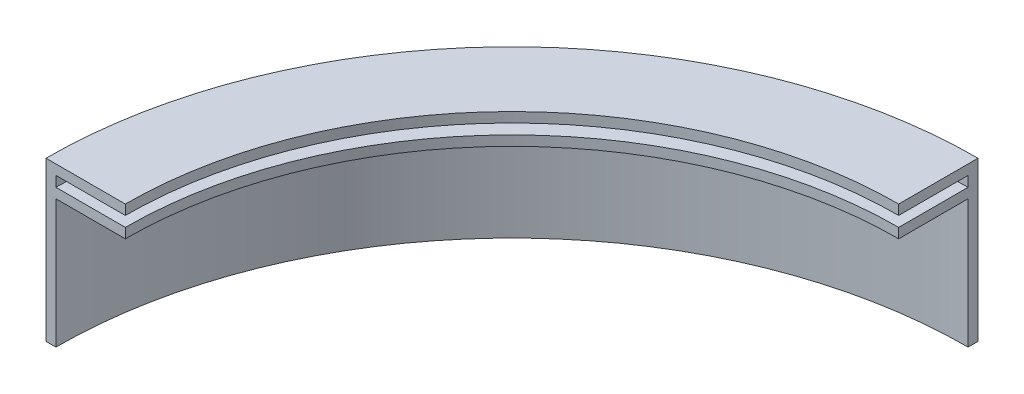
ISO-10303-21;
HEADER;
FILE_DESCRIPTION(('STEP AP214'),'2;1');
FILE_NAME('part.step','',(''),(''),'','','');
FILE_SCHEMA(('AUTOMOTIVE_DESIGN { 1 0 10303 214 1 1 1 1 }'));
ENDSEC;
DATA;
#1=APPLICATION_CONTEXT('core data for automotive mechanical design processes');
#2=APPLICATION_PROTOCOL_DEFINITION('international standard','automotive_design',2000,#1);
#3=PRODUCT_CONTEXT('',#1,'mechanical');
#4=PRODUCT('Part','Part','',(#3));
#5=PRODUCT_RELATED_PRODUCT_CATEGORY('part','',(#4));
#6=PRODUCT_DEFINITION_FORMATION('','',#4);
#7=PRODUCT_DEFINITION_CONTEXT('part definition',#1,'design');
#8=PRODUCT_DEFINITION('design','',#6,#7);
#9=PRODUCT_DEFINITION_SHAPE('','',#8);
#10=(LENGTH_UNIT() NAMED_UNIT(*) SI_UNIT(.MILLI.,.METRE.));
#11=(NAMED_UNIT(*) PLANE_ANGLE_UNIT() SI_UNIT($,.RADIAN.));
#12=(NAMED_UNIT(*) SI_UNIT($,.STERADIAN.) SOLID_ANGLE_UNIT());
#13=UNCERTAINTY_MEASURE_WITH_UNIT(LENGTH_MEASURE(1.E-05),#10,'distance_accuracy_value','');
#14=(GEOMETRIC_REPRESENTATION_CONTEXT(3) GLOBAL_UNCERTAINTY_ASSIGNED_CONTEXT((#13)) GLOBAL_UNIT_ASSIGNED_CONTEXT((#10,
#11,#12)) REPRESENTATION_CONTEXT('',''));
#15=CARTESIAN_POINT('',(0.,0.,0.));
#16=DIRECTION('',(0.,0.,1.));
#17=DIRECTION('',(1.,0.,0.));
#18=AXIS2_PLACEMENT_3D('',#15,#16,#17);
#19=CARTESIAN_POINT('',(149.225000000001,0.,-146.05));
#20=DIRECTION('',(0.,-1.,0.));
#21=DIRECTION('',(0.,0.,-1.));
#22=AXIS2_PLACEMENT_3D('',#19,#20,#21);
#23=PLANE('',#22);
#24=CARTESIAN_POINT('',(149.225,0.,0.));
#25=DIRECTION('',(0.,1.,0.));
#26=DIRECTION('',(0.,0.,1.));
#27=AXIS2_PLACEMENT_3D('',#24,#25,#26);
#28=CIRCLE('',#27,149.225);
#29=CARTESIAN_POINT('',(149.225000000001,0.,-149.225));
#30=VERTEX_POINT('',#29);
#31=CARTESIAN_POINT('',(0.,0.,0.));
#32=VERTEX_POINT('',#31);
#33=EDGE_CURVE('E11',#30,#32,#28,.T.);
#34=ORIENTED_EDGE('',*,*,#33,.F.);
#35=DIRECTION('',(0.,0.,1.));
#36=VECTOR('',#35,1.);
#37=CARTESIAN_POINT('',(149.225000000001,0.,-146.05));
#38=LINE('',#37,#36);
#39=CARTESIAN_POINT('',(149.225000000001,0.,-146.05));
#40=VERTEX_POINT('',#39);
#41=EDGE_CURVE('E109',#30,#40,#38,.T.);
#42=ORIENTED_EDGE('',*,*,#41,.T.);
#43=CARTESIAN_POINT('',(149.225,0.,0.));
#44=DIRECTION('',(0.,1.,0.));
#45=DIRECTION('',(0.,0.,1.));
#46=AXIS2_PLACEMENT_3D('',#43,#44,#45);
#47=CIRCLE('',#46,146.05);
#48=CARTESIAN_POINT('',(3.175,0.,0.));
#49=VERTEX_POINT('',#48);
#50=EDGE_CURVE('E104',#40,#49,#47,.T.);
#51=ORIENTED_EDGE('',*,*,#50,.T.);
#52=DIRECTION('',(1.,0.,0.));
#53=VECTOR('',#52,1.);
#54=CARTESIAN_POINT('',(3.175,0.,0.));
#55=LINE('',#54,#53);
#56=EDGE_CURVE('E107',#32,#49,#55,.T.);
#57=ORIENTED_EDGE('',*,*,#56,.F.);
#58=EDGE_LOOP('',(#34,#42,#51,#57));
#59=FACE_BOUND('',#58,.T.);
#60=ADVANCED_FACE('F32',(#59),#23,.T.);
#61=CARTESIAN_POINT('',(149.225,38.1,0.));
#62=DIRECTION('',(0.,1.,0.));
#63=DIRECTION('',(0.,0.,1.));
#64=AXIS2_PLACEMENT_3D('',#61,#62,#63);
#65=CYLINDRICAL_SURFACE('',#64,149.225);
#66=CARTESIAN_POINT('',(149.225,50.8,0.));
#67=DIRECTION('',(0.,1.,0.));
#68=DIRECTION('',(0.,0.,1.));
#69=AXIS2_PLACEMENT_3D('',#66,#67,#68);
#70=CIRCLE('',#69,149.225);
#71=CARTESIAN_POINT('',(149.225000000001,50.8,-149.225));
#72=VERTEX_POINT('',#71);
#73=CARTESIAN_POINT('',(0.,50.8,0.));
#74=VERTEX_POINT('',#73);
#75=EDGE_CURVE('E40',#72,#74,#70,.T.);
#76=ORIENTED_EDGE('',*,*,#75,.F.);
#77=DIRECTION('',(0.,-1.,0.));
#78=VECTOR('',#77,1.);
#79=CARTESIAN_POINT('',(149.225000000001,0.,-149.225));
#80=LINE('',#79,#78);
#81=EDGE_CURVE('E114',#72,#30,#80,.T.);
#82=ORIENTED_EDGE('',*,*,#81,.T.);
#83=ORIENTED_EDGE('',*,*,#33,.T.);
#84=DIRECTION('',(0.,-1.,0.));
#85=VECTOR('',#84,1.);
#86=CARTESIAN_POINT('',(0.,0.,0.));
#87=LINE('',#86,#85);
#88=EDGE_CURVE('E127',#74,#32,#87,.T.);
#89=ORIENTED_EDGE('',*,*,#88,.F.);
#90=EDGE_LOOP('',(#76,#82,#83,#89));
#91=FACE_BOUND('',#90,.T.);
#92=ADVANCED_FACE('F34',(#91),#65,.T.);
#93=CARTESIAN_POINT('',(149.225000000001,50.8,-149.225));
#94=DIRECTION('',(0.,1.,0.));
#95=DIRECTION('',(0.,0.,1.));
#96=AXIS2_PLACEMENT_3D('',#93,#94,#95);
#97=PLANE('',#96);
#98=CARTESIAN_POINT('',(149.225,50.8,0.));
#99=DIRECTION('',(0.,1.,0.));
#100=DIRECTION('',(0.,0.,1.));
#101=AXIS2_PLACEMENT_3D('',#98,#99,#100);
#102=CIRCLE('',#101,123.825);
#103=CARTESIAN_POINT('',(149.225,50.8,-123.825));
#104=VERTEX_POINT('',#103);
#105=CARTESIAN_POINT('',(25.4,50.8,0.));
#106=VERTEX_POINT('',#105);
#107=EDGE_CURVE('E184',#104,#106,#102,.T.);
#108=ORIENTED_EDGE('',*,*,#107,.F.);
#109=DIRECTION('',(0.,0.,-1.));
#110=VECTOR('',#109,1.);
#111=CARTESIAN_POINT('',(149.225000000001,50.8,-149.225));
#112=LINE('',#111,#110);
#113=EDGE_CURVE('E170',#104,#72,#112,.T.);
#114=ORIENTED_EDGE('',*,*,#113,.T.);
#115=ORIENTED_EDGE('',*,*,#75,.T.);
#116=DIRECTION('',(-1.,0.,0.));
#117=VECTOR('',#116,1.);
#118=CARTESIAN_POINT('',(0.,50.8,0.));
#119=LINE('',#118,#117);
#120=EDGE_CURVE('E146',#106,#74,#119,.T.);
#121=ORIENTED_EDGE('',*,*,#120,.F.);
#122=EDGE_LOOP('',(#108,#114,#115,#121));
#123=FACE_BOUND('',#122,.T.);
#124=ADVANCED_FACE('F187',(#123),#97,.T.);
#125=CARTESIAN_POINT('',(149.225,38.1,0.));
#126=DIRECTION('',(0.,1.,0.));
#127=DIRECTION('',(0.,0.,1.));
#128=AXIS2_PLACEMENT_3D('',#125,#126,#127);
#129=CYLINDRICAL_SURFACE('',#128,123.825);
#130=CARTESIAN_POINT('',(149.225,47.625,0.));
#131=DIRECTION('',(0.,1.,0.));
#132=DIRECTION('',(0.,0.,1.));
#133=AXIS2_PLACEMENT_3D('',#130,#131,#132);
#134=CIRCLE('',#133,123.825);
#135=CARTESIAN_POINT('',(149.225,47.625,-123.825));
#136=VERTEX_POINT('',#135);
#137=CARTESIAN_POINT('',(25.4,47.625,0.));
#138=VERTEX_POINT('',#137);
#139=EDGE_CURVE('E182',#136,#138,#134,.T.);
#140=ORIENTED_EDGE('',*,*,#139,.F.);
#141=DIRECTION('',(0.,1.,0.));
#142=VECTOR('',#141,1.);
#143=CARTESIAN_POINT('',(149.225,50.8,-123.825));
#144=LINE('',#143,#142);
#145=EDGE_CURVE('E167',#136,#104,#144,.T.);
#146=ORIENTED_EDGE('',*,*,#145,.T.);
#147=ORIENTED_EDGE('',*,*,#107,.T.);
#148=DIRECTION('',(0.,1.,0.));
#149=VECTOR('',#148,1.);
#150=CARTESIAN_POINT('',(25.4,50.8,0.));
#151=LINE('',#150,#149);
#152=EDGE_CURVE('E143',#138,#106,#151,.T.);
#153=ORIENTED_EDGE('',*,*,#152,.F.);
#154=EDGE_LOOP('',(#140,#146,#147,#153));
#155=FACE_BOUND('',#154,.T.);
#156=ADVANCED_FACE('F214',(#155),#129,.F.);
#157=CARTESIAN_POINT('',(149.225,47.625,-123.825));
#158=DIRECTION('',(0.,-1.,0.));
#159=DIRECTION('',(0.,0.,-1.));
#160=AXIS2_PLACEMENT_3D('',#157,#158,#159);
#161=PLANE('',#160);
#162=CARTESIAN_POINT('',(149.225,47.625,0.));
#163=DIRECTION('',(0.,1.,0.));
#164=DIRECTION('',(0.,0.,1.));
#165=AXIS2_PLACEMENT_3D('',#162,#163,#164);
#166=CIRCLE('',#165,146.05);
#167=CARTESIAN_POINT('',(149.225000000001,47.625,-146.05));
#168=VERTEX_POINT('',#167);
#169=CARTESIAN_POINT('',(3.175,47.625,0.));
#170=VERTEX_POINT('',#169);
#171=EDGE_CURVE('E180',#168,#170,#166,.T.);
#172=ORIENTED_EDGE('',*,*,#171,.F.);
#173=DIRECTION('',(0.,0.,1.));
#174=VECTOR('',#173,1.);
#175=CARTESIAN_POINT('',(149.225,47.625,-123.825));
#176=LINE('',#175,#174);
#177=EDGE_CURVE('E164',#168,#136,#176,.T.);
#178=ORIENTED_EDGE('',*,*,#177,.T.);
#179=ORIENTED_EDGE('',*,*,#139,.T.);
#180=DIRECTION('',(1.,0.,0.));
#181=VECTOR('',#180,1.);
#182=CARTESIAN_POINT('',(25.4,47.625,0.));
#183=LINE('',#182,#181);
#184=EDGE_CURVE('E140',#170,#138,#183,.T.);
#185=ORIENTED_EDGE('',*,*,#184,.F.);
#186=EDGE_LOOP('',(#172,#178,#179,#185));
#187=FACE_BOUND('',#186,.T.);
#188=ADVANCED_FACE('F211',(#187),#161,.T.);
#189=CARTESIAN_POINT('',(149.225,38.1,0.));
#190=DIRECTION('',(0.,1.,0.));
#191=DIRECTION('',(0.,0.,1.));
#192=AXIS2_PLACEMENT_3D('',#189,#190,#191);
#193=CYLINDRICAL_SURFACE('',#192,146.05);
#194=CARTESIAN_POINT('',(149.225,44.323,0.));
#195=DIRECTION('',(0.,1.,0.));
#196=DIRECTION('',(0.,0.,1.));
#197=AXIS2_PLACEMENT_3D('',#194,#195,#196);
#198=CIRCLE('',#197,146.05);
#199=CARTESIAN_POINT('',(149.225000000001,44.323,-146.05));
#200=VERTEX_POINT('',#199);
#201=CARTESIAN_POINT('',(3.175,44.323,0.));
#202=VERTEX_POINT('',#201);
#203=EDGE_CURVE('E178',#200,#202,#198,.T.);
#204=ORIENTED_EDGE('',*,*,#203,.F.);
#205=DIRECTION('',(0.,1.,0.));
#206=VECTOR('',#205,1.);
#207=CARTESIAN_POINT('',(149.225000000001,47.625,-146.05));
#208=LINE('',#207,#206);
#209=EDGE_CURVE('E161',#200,#168,#208,.T.);
#210=ORIENTED_EDGE('',*,*,#209,.T.);
#211=ORIENTED_EDGE('',*,*,#171,.T.);
#212=DIRECTION('',(0.,1.,0.));
#213=VECTOR('',#212,1.);
#214=CARTESIAN_POINT('',(3.175,47.625,0.));
#215=LINE('',#214,#213);
#216=EDGE_CURVE('E137',#202,#170,#215,.T.);
#217=ORIENTED_EDGE('',*,*,#216,.F.);
#218=EDGE_LOOP('',(#204,#210,#211,#217));
#219=FACE_BOUND('',#218,.T.);
#220=ADVANCED_FACE('F208',(#219),#193,.F.);
#221=CARTESIAN_POINT('',(149.225000000001,44.323,-146.05));
#222=DIRECTION('',(0.,1.,0.));
#223=DIRECTION('',(0.,0.,1.));
#224=AXIS2_PLACEMENT_3D('',#221,#222,#223);
#225=PLANE('',#224);
#226=CARTESIAN_POINT('',(149.225,44.323,0.));
#227=DIRECTION('',(0.,1.,0.));
#228=DIRECTION('',(0.,0.,1.));
#229=AXIS2_PLACEMENT_3D('',#226,#227,#228);
#230=CIRCLE('',#229,123.825);
#231=CARTESIAN_POINT('',(149.225,44.323,-123.825));
#232=VERTEX_POINT('',#231);
#233=CARTESIAN_POINT('',(25.4,44.323,0.));
#234=VERTEX_POINT('',#233);
#235=EDGE_CURVE('E176',#232,#234,#230,.T.);
#236=ORIENTED_EDGE('',*,*,#235,.F.);
#237=DIRECTION('',(0.,0.,-1.));
#238=VECTOR('',#237,1.);
#239=CARTESIAN_POINT('',(149.225000000001,44.323,-146.05));
#240=LINE('',#239,#238);
#241=EDGE_CURVE('E158',#232,#200,#240,.T.);
#242=ORIENTED_EDGE('',*,*,#241,.T.);
#243=ORIENTED_EDGE('',*,*,#203,.T.);
#244=DIRECTION('',(-1.,0.,0.));
#245=VECTOR('',#244,1.);
#246=CARTESIAN_POINT('',(3.175,44.323,0.));
#247=LINE('',#246,#245);
#248=EDGE_CURVE('E134',#234,#202,#247,.T.);
#249=ORIENTED_EDGE('',*,*,#248,.F.);
#250=EDGE_LOOP('',(#236,#242,#243,#249));
#251=FACE_BOUND('',#250,.T.);
#252=ADVANCED_FACE('F203',(#251),#225,.T.);
#253=CARTESIAN_POINT('',(149.225,38.1,0.));
#254=DIRECTION('',(0.,1.,0.));
#255=DIRECTION('',(0.,0.,1.));
#256=AXIS2_PLACEMENT_3D('',#253,#254,#255);
#257=CYLINDRICAL_SURFACE('',#256,123.825);
#258=CARTESIAN_POINT('',(149.225,41.148,0.));
#259=DIRECTION('',(0.,1.,0.));
#260=DIRECTION('',(0.,0.,1.));
#261=AXIS2_PLACEMENT_3D('',#258,#259,#260);
#262=CIRCLE('',#261,123.825);
#263=CARTESIAN_POINT('',(149.225,41.148,-123.825));
#264=VERTEX_POINT('',#263);
#265=CARTESIAN_POINT('',(25.4,41.148,0.));
#266=VERTEX_POINT('',#265);
#267=EDGE_CURVE('E174',#264,#266,#262,.T.);
#268=ORIENTED_EDGE('',*,*,#267,.F.);
#269=DIRECTION('',(0.,1.,0.));
#270=VECTOR('',#269,1.);
#271=CARTESIAN_POINT('',(149.225,44.323,-123.825));
#272=LINE('',#271,#270);
#273=EDGE_CURVE('E155',#264,#232,#272,.T.);
#274=ORIENTED_EDGE('',*,*,#273,.T.);
#275=ORIENTED_EDGE('',*,*,#235,.T.);
#276=DIRECTION('',(0.,1.,0.));
#277=VECTOR('',#276,1.);
#278=CARTESIAN_POINT('',(25.4,44.323,0.));
#279=LINE('',#278,#277);
#280=EDGE_CURVE('E131',#266,#234,#279,.T.);
#281=ORIENTED_EDGE('',*,*,#280,.F.);
#282=EDGE_LOOP('',(#268,#274,#275,#281));
#283=FACE_BOUND('',#282,.T.);
#284=ADVANCED_FACE('F201',(#283),#257,.F.);
#285=CARTESIAN_POINT('',(149.225,41.148,-123.825));
#286=DIRECTION('',(0.,-1.,0.));
#287=DIRECTION('',(0.,0.,-1.));
#288=AXIS2_PLACEMENT_3D('',#285,#286,#287);
#289=PLANE('',#288);
#290=CARTESIAN_POINT('',(149.225,41.148,0.));
#291=DIRECTION('',(0.,1.,0.));
#292=DIRECTION('',(0.,0.,1.));
#293=AXIS2_PLACEMENT_3D('',#290,#291,#292);
#294=CIRCLE('',#293,146.05);
#295=CARTESIAN_POINT('',(149.225000000001,41.148,-146.05));
#296=VERTEX_POINT('',#295);
#297=CARTESIAN_POINT('',(3.175,41.148,0.));
#298=VERTEX_POINT('',#297);
#299=EDGE_CURVE('E113',#296,#298,#294,.T.);
#300=ORIENTED_EDGE('',*,*,#299,.F.);
#301=DIRECTION('',(0.,0.,1.));
#302=VECTOR('',#301,1.);
#303=CARTESIAN_POINT('',(149.225,41.148,-123.825));
#304=LINE('',#303,#302);
#305=EDGE_CURVE('E152',#296,#264,#304,.T.);
#306=ORIENTED_EDGE('',*,*,#305,.T.);
#307=ORIENTED_EDGE('',*,*,#267,.T.);
#308=DIRECTION('',(1.,0.,0.));
#309=VECTOR('',#308,1.);
#310=CARTESIAN_POINT('',(25.4,41.148,0.));
#311=LINE('',#310,#309);
#312=EDGE_CURVE('E122',#298,#266,#311,.T.);
#313=ORIENTED_EDGE('',*,*,#312,.F.);
#314=EDGE_LOOP('',(#300,#306,#307,#313));
#315=FACE_BOUND('',#314,.T.);
#316=ADVANCED_FACE('F197',(#315),#289,.T.);
#317=CARTESIAN_POINT('',(149.225,38.1,0.));
#318=DIRECTION('',(0.,1.,0.));
#319=DIRECTION('',(0.,0.,1.));
#320=AXIS2_PLACEMENT_3D('',#317,#318,#319);
#321=CYLINDRICAL_SURFACE('',#320,146.05);
#322=DIRECTION('',(0.,1.,0.));
#323=VECTOR('',#322,1.);
#324=CARTESIAN_POINT('',(149.225000000001,41.148,-146.05));
#325=LINE('',#324,#323);
#326=EDGE_CURVE('E150',#40,#296,#325,.T.);
#327=ORIENTED_EDGE('',*,*,#326,.T.);
#328=ORIENTED_EDGE('',*,*,#299,.T.);
#329=DIRECTION('',(0.,1.,0.));
#330=VECTOR('',#329,1.);
#331=CARTESIAN_POINT('',(3.175,41.148,0.));
#332=LINE('',#331,#330);
#333=EDGE_CURVE('E117',#49,#298,#332,.T.);
#334=ORIENTED_EDGE('',*,*,#333,.F.);
#335=ORIENTED_EDGE('',*,*,#50,.F.);
#336=EDGE_LOOP('',(#327,#328,#334,#335));
#337=FACE_BOUND('',#336,.T.);
#338=ADVANCED_FACE('F118',(#337),#321,.F.);
#339=CARTESIAN_POINT('',(149.225000000001,0.,-149.225));
#340=DIRECTION('',(1.,0.,0.));
#341=DIRECTION('',(0.,0.,-1.));
#342=AXIS2_PLACEMENT_3D('',#339,#340,#341);
#343=PLANE('',#342);
#344=ORIENTED_EDGE('',*,*,#41,.F.);
#345=ORIENTED_EDGE('',*,*,#81,.F.);
#346=ORIENTED_EDGE('',*,*,#113,.F.);
#347=ORIENTED_EDGE('',*,*,#145,.F.);
#348=ORIENTED_EDGE('',*,*,#177,.F.);
#349=ORIENTED_EDGE('',*,*,#209,.F.);
#350=ORIENTED_EDGE('',*,*,#241,.F.);
#351=ORIENTED_EDGE('',*,*,#273,.F.);
#352=ORIENTED_EDGE('',*,*,#305,.F.);
#353=ORIENTED_EDGE('',*,*,#326,.F.);
#354=EDGE_LOOP('',(#344,#345,#346,#347,#348,#349,#350,#351,#352,#353));
#355=FACE_BOUND('',#354,.T.);
#356=ADVANCED_FACE('F192',(#355),#343,.T.);
#357=CARTESIAN_POINT('',(0.,0.,0.));
#358=DIRECTION('',(0.,0.,-1.));
#359=DIRECTION('',(-1.,0.,0.));
#360=AXIS2_PLACEMENT_3D('',#357,#358,#359);
#361=PLANE('',#360);
#362=ORIENTED_EDGE('',*,*,#56,.T.);
#363=ORIENTED_EDGE('',*,*,#333,.T.);
#364=ORIENTED_EDGE('',*,*,#312,.T.);
#365=ORIENTED_EDGE('',*,*,#280,.T.);
#366=ORIENTED_EDGE('',*,*,#248,.T.);
#367=ORIENTED_EDGE('',*,*,#216,.T.);
#368=ORIENTED_EDGE('',*,*,#184,.T.);
#369=ORIENTED_EDGE('',*,*,#152,.T.);
#370=ORIENTED_EDGE('',*,*,#120,.T.);
#371=ORIENTED_EDGE('',*,*,#88,.T.);
#372=EDGE_LOOP('',(#362,#363,#364,#365,#366,#367,#368,#369,#370,#371));
#373=FACE_BOUND('',#372,.T.);
#374=ADVANCED_FACE('F125',(#373),#361,.F.);
#375=CLOSED_SHELL('',(#60,#92,#124,#156,#188,#220,#252,#284,#316,#338,#356,#374));
#376=MANIFOLD_SOLID_BREP('B2',#375);
#377=ADVANCED_BREP_SHAPE_REPRESENTATION('',(#18,#376),#14);
#378=SHAPE_DEFINITION_REPRESENTATION(#9,#377);
ENDSEC;
END-ISO-10303-21;
